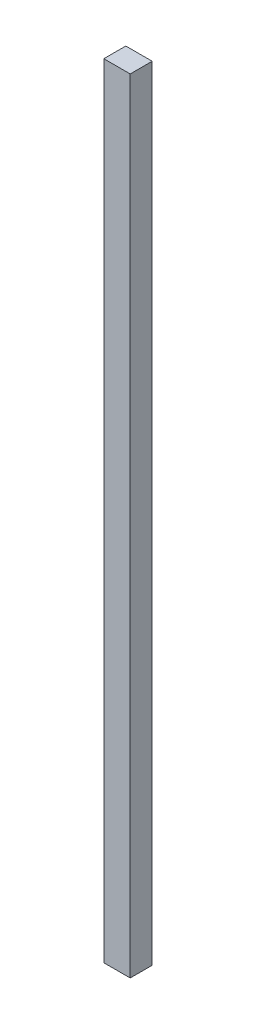
ISO-10303-21;
HEADER;
FILE_DESCRIPTION(('STEP AP214'),'2;1');
FILE_NAME('part.step','',(''),(''),'','','');
FILE_SCHEMA(('AUTOMOTIVE_DESIGN { 1 0 10303 214 1 1 1 1 }'));
ENDSEC;
DATA;
#1=APPLICATION_CONTEXT('core data for automotive mechanical design processes');
#2=APPLICATION_PROTOCOL_DEFINITION('international standard','automotive_design',2000,#1);
#3=PRODUCT_CONTEXT('',#1,'mechanical');
#4=PRODUCT('Part','Part','',(#3));
#5=PRODUCT_RELATED_PRODUCT_CATEGORY('part','',(#4));
#6=PRODUCT_DEFINITION_FORMATION('','',#4);
#7=PRODUCT_DEFINITION_CONTEXT('part definition',#1,'design');
#8=PRODUCT_DEFINITION('design','',#6,#7);
#9=PRODUCT_DEFINITION_SHAPE('','',#8);
#10=(LENGTH_UNIT() NAMED_UNIT(*) SI_UNIT(.MILLI.,.METRE.));
#11=(NAMED_UNIT(*) PLANE_ANGLE_UNIT() SI_UNIT($,.RADIAN.));
#12=(NAMED_UNIT(*) SI_UNIT($,.STERADIAN.) SOLID_ANGLE_UNIT());
#13=UNCERTAINTY_MEASURE_WITH_UNIT(LENGTH_MEASURE(1.E-05),#10,'distance_accuracy_value','');
#14=(GEOMETRIC_REPRESENTATION_CONTEXT(3) GLOBAL_UNCERTAINTY_ASSIGNED_CONTEXT((#13)) GLOBAL_UNIT_ASSIGNED_CONTEXT((#10,
#11,#12)) REPRESENTATION_CONTEXT('',''));
#15=CARTESIAN_POINT('',(0.,0.,0.));
#16=DIRECTION('',(0.,0.,1.));
#17=DIRECTION('',(1.,0.,0.));
#18=AXIS2_PLACEMENT_3D('',#15,#16,#17);
#19=CARTESIAN_POINT('',(0.,178.,5.));
#20=DIRECTION('',(1.,0.,0.));
#21=DIRECTION('',(0.,0.,-1.));
#22=AXIS2_PLACEMENT_3D('',#19,#20,#21);
#23=PLANE('',#22);
#24=DIRECTION('',(0.,-1.,0.));
#25=VECTOR('',#24,1.);
#26=CARTESIAN_POINT('',(0.,178.,0.));
#27=LINE('',#26,#25);
#28=CARTESIAN_POINT('',(0.,178.,0.));
#29=VERTEX_POINT('',#28);
#30=CARTESIAN_POINT('',(0.,0.,0.));
#31=VERTEX_POINT('',#30);
#32=EDGE_CURVE('E102',#29,#31,#27,.T.);
#33=ORIENTED_EDGE('',*,*,#32,.T.);
#34=DIRECTION('',(0.,0.,-1.));
#35=VECTOR('',#34,1.);
#36=CARTESIAN_POINT('',(0.,0.,5.));
#37=LINE('',#36,#35);
#38=CARTESIAN_POINT('',(0.,0.,5.));
#39=VERTEX_POINT('',#38);
#40=EDGE_CURVE('E11',#39,#31,#37,.T.);
#41=ORIENTED_EDGE('',*,*,#40,.F.);
#42=DIRECTION('',(0.,-1.,0.));
#43=VECTOR('',#42,1.);
#44=CARTESIAN_POINT('',(0.,178.,5.));
#45=LINE('',#44,#43);
#46=CARTESIAN_POINT('',(0.,178.,5.));
#47=VERTEX_POINT('',#46);
#48=EDGE_CURVE('E90',#47,#39,#45,.T.);
#49=ORIENTED_EDGE('',*,*,#48,.F.);
#50=DIRECTION('',(0.,0.,-1.));
#51=VECTOR('',#50,1.);
#52=CARTESIAN_POINT('',(0.,178.,5.));
#53=LINE('',#52,#51);
#54=EDGE_CURVE('E98',#47,#29,#53,.T.);
#55=ORIENTED_EDGE('',*,*,#54,.T.);
#56=EDGE_LOOP('',(#33,#41,#49,#55));
#57=FACE_BOUND('',#56,.T.);
#58=ADVANCED_FACE('F39',(#57),#23,.F.);
#59=CARTESIAN_POINT('',(0.,0.,5.));
#60=DIRECTION('',(0.,1.,0.));
#61=DIRECTION('',(0.,0.,1.));
#62=AXIS2_PLACEMENT_3D('',#59,#60,#61);
#63=PLANE('',#62);
#64=DIRECTION('',(1.,0.,0.));
#65=VECTOR('',#64,1.);
#66=CARTESIAN_POINT('',(0.,0.,0.));
#67=LINE('',#66,#65);
#68=CARTESIAN_POINT('',(6.,0.,0.));
#69=VERTEX_POINT('',#68);
#70=EDGE_CURVE('E94',#31,#69,#67,.T.);
#71=ORIENTED_EDGE('',*,*,#70,.T.);
#72=DIRECTION('',(0.,0.,-1.));
#73=VECTOR('',#72,1.);
#74=CARTESIAN_POINT('',(6.,0.,5.));
#75=LINE('',#74,#73);
#76=CARTESIAN_POINT('',(6.,0.,5.));
#77=VERTEX_POINT('',#76);
#78=EDGE_CURVE('E47',#77,#69,#75,.T.);
#79=ORIENTED_EDGE('',*,*,#78,.F.);
#80=DIRECTION('',(1.,0.,0.));
#81=VECTOR('',#80,1.);
#82=CARTESIAN_POINT('',(0.,0.,5.));
#83=LINE('',#82,#81);
#84=EDGE_CURVE('E85',#39,#77,#83,.T.);
#85=ORIENTED_EDGE('',*,*,#84,.F.);
#86=ORIENTED_EDGE('',*,*,#40,.T.);
#87=EDGE_LOOP('',(#71,#79,#85,#86));
#88=FACE_BOUND('',#87,.T.);
#89=ADVANCED_FACE('F93',(#88),#63,.F.);
#90=CARTESIAN_POINT('',(6.,0.,5.));
#91=DIRECTION('',(-1.,0.,0.));
#92=DIRECTION('',(0.,0.,1.));
#93=AXIS2_PLACEMENT_3D('',#90,#91,#92);
#94=PLANE('',#93);
#95=DIRECTION('',(0.,1.,0.));
#96=VECTOR('',#95,1.);
#97=CARTESIAN_POINT('',(6.,0.,0.));
#98=LINE('',#97,#96);
#99=CARTESIAN_POINT('',(6.,178.,0.));
#100=VERTEX_POINT('',#99);
#101=EDGE_CURVE('E72',#69,#100,#98,.T.);
#102=ORIENTED_EDGE('',*,*,#101,.T.);
#103=DIRECTION('',(0.,0.,-1.));
#104=VECTOR('',#103,1.);
#105=CARTESIAN_POINT('',(6.,178.,5.));
#106=LINE('',#105,#104);
#107=CARTESIAN_POINT('',(6.,178.,5.));
#108=VERTEX_POINT('',#107);
#109=EDGE_CURVE('E95',#108,#100,#106,.T.);
#110=ORIENTED_EDGE('',*,*,#109,.F.);
#111=DIRECTION('',(0.,1.,0.));
#112=VECTOR('',#111,1.);
#113=CARTESIAN_POINT('',(6.,0.,5.));
#114=LINE('',#113,#112);
#115=EDGE_CURVE('E88',#77,#108,#114,.T.);
#116=ORIENTED_EDGE('',*,*,#115,.F.);
#117=ORIENTED_EDGE('',*,*,#78,.T.);
#118=EDGE_LOOP('',(#102,#110,#116,#117));
#119=FACE_BOUND('',#118,.T.);
#120=ADVANCED_FACE('F96',(#119),#94,.F.);
#121=CARTESIAN_POINT('',(6.,178.,5.));
#122=DIRECTION('',(0.,-1.,0.));
#123=DIRECTION('',(0.,0.,-1.));
#124=AXIS2_PLACEMENT_3D('',#121,#122,#123);
#125=PLANE('',#124);
#126=DIRECTION('',(-1.,0.,0.));
#127=VECTOR('',#126,1.);
#128=CARTESIAN_POINT('',(6.,178.,0.));
#129=LINE('',#128,#127);
#130=EDGE_CURVE('E78',#100,#29,#129,.T.);
#131=ORIENTED_EDGE('',*,*,#130,.T.);
#132=ORIENTED_EDGE('',*,*,#54,.F.);
#133=DIRECTION('',(-1.,0.,0.));
#134=VECTOR('',#133,1.);
#135=CARTESIAN_POINT('',(6.,178.,5.));
#136=LINE('',#135,#134);
#137=EDGE_CURVE('E55',#108,#47,#136,.T.);
#138=ORIENTED_EDGE('',*,*,#137,.F.);
#139=ORIENTED_EDGE('',*,*,#109,.T.);
#140=EDGE_LOOP('',(#131,#132,#138,#139));
#141=FACE_BOUND('',#140,.T.);
#142=ADVANCED_FACE('F109',(#141),#125,.F.);
#143=CARTESIAN_POINT('',(0.,0.,5.));
#144=DIRECTION('',(0.,0.,1.));
#145=DIRECTION('',(1.,0.,0.));
#146=AXIS2_PLACEMENT_3D('',#143,#144,#145);
#147=PLANE('',#146);
#148=ORIENTED_EDGE('',*,*,#48,.T.);
#149=ORIENTED_EDGE('',*,*,#84,.T.);
#150=ORIENTED_EDGE('',*,*,#115,.T.);
#151=ORIENTED_EDGE('',*,*,#137,.T.);
#152=EDGE_LOOP('',(#148,#149,#150,#151));
#153=FACE_BOUND('',#152,.T.);
#154=ADVANCED_FACE('F86',(#153),#147,.T.);
#155=CARTESIAN_POINT('',(0.,0.,0.));
#156=DIRECTION('',(0.,0.,1.));
#157=DIRECTION('',(1.,0.,0.));
#158=AXIS2_PLACEMENT_3D('',#155,#156,#157);
#159=PLANE('',#158);
#160=ORIENTED_EDGE('',*,*,#32,.F.);
#161=ORIENTED_EDGE('',*,*,#130,.F.);
#162=ORIENTED_EDGE('',*,*,#101,.F.);
#163=ORIENTED_EDGE('',*,*,#70,.F.);
#164=EDGE_LOOP('',(#160,#161,#162,#163));
#165=FACE_BOUND('',#164,.T.);
#166=ADVANCED_FACE('F112',(#165),#159,.F.);
#167=CLOSED_SHELL('',(#58,#89,#120,#142,#154,#166));
#168=MANIFOLD_SOLID_BREP('B2',#167);
#169=ADVANCED_BREP_SHAPE_REPRESENTATION('',(#18,#168),#14);
#170=SHAPE_DEFINITION_REPRESENTATION(#9,#169);
ENDSEC;
END-ISO-10303-21;
